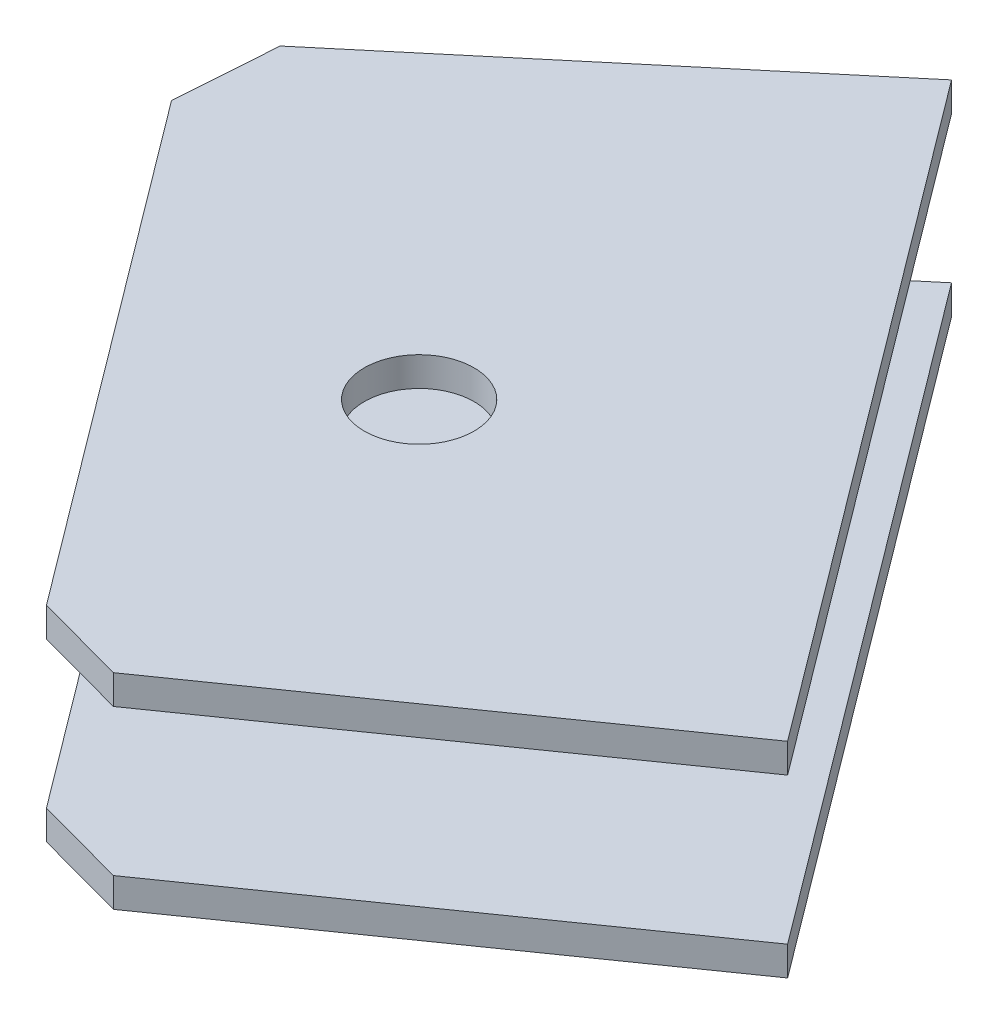
ISO-10303-21;
HEADER;
FILE_DESCRIPTION(('STEP AP214'),'2;1');
FILE_NAME('part.step','',(''),(''),'','','');
FILE_SCHEMA(('AUTOMOTIVE_DESIGN { 1 0 10303 214 1 1 1 1 }'));
ENDSEC;
DATA;
#1=APPLICATION_CONTEXT('core data for automotive mechanical design processes');
#2=APPLICATION_PROTOCOL_DEFINITION('international standard','automotive_design',2000,#1);
#3=PRODUCT_CONTEXT('',#1,'mechanical');
#4=PRODUCT('Part','Part','',(#3));
#5=PRODUCT_RELATED_PRODUCT_CATEGORY('part','',(#4));
#6=PRODUCT_DEFINITION_FORMATION('','',#4);
#7=PRODUCT_DEFINITION_CONTEXT('part definition',#1,'design');
#8=PRODUCT_DEFINITION('design','',#6,#7);
#9=PRODUCT_DEFINITION_SHAPE('','',#8);
#10=(LENGTH_UNIT() NAMED_UNIT(*) SI_UNIT(.MILLI.,.METRE.));
#11=(NAMED_UNIT(*) PLANE_ANGLE_UNIT() SI_UNIT($,.RADIAN.));
#12=(NAMED_UNIT(*) SI_UNIT($,.STERADIAN.) SOLID_ANGLE_UNIT());
#13=UNCERTAINTY_MEASURE_WITH_UNIT(LENGTH_MEASURE(1.E-05),#10,'distance_accuracy_value','');
#14=(GEOMETRIC_REPRESENTATION_CONTEXT(3) GLOBAL_UNCERTAINTY_ASSIGNED_CONTEXT((#13)) GLOBAL_UNIT_ASSIGNED_CONTEXT((#10,
#11,#12)) REPRESENTATION_CONTEXT('',''));
#15=CARTESIAN_POINT('',(0.,0.,0.));
#16=DIRECTION('',(0.,0.,1.));
#17=DIRECTION('',(1.,0.,0.));
#18=AXIS2_PLACEMENT_3D('',#15,#16,#17);
#19=CARTESIAN_POINT('',(41.6555289758713,-8.89,9.6980282279427));
#20=DIRECTION('',(0.800145765414735,0.,-0.59980559691359));
#21=DIRECTION('',(-0.59980559691359,0.,-0.800145765414735));
#22=AXIS2_PLACEMENT_3D('',#19,#20,#21);
#23=PLANE('',#22);
#24=DIRECTION('',(-0.59980559691359,0.,-0.800145765414735));
#25=VECTOR('',#24,1.);
#26=CARTESIAN_POINT('',(41.6555289758713,-6.35,9.6980282279427));
#27=LINE('',#26,#25);
#28=CARTESIAN_POINT('',(41.6555289758713,-6.35,9.6980282279427));
#29=VERTEX_POINT('',#28);
#30=CARTESIAN_POINT('',(-0.915104632580494,-6.35,-47.0915589117921));
#31=VERTEX_POINT('',#30);
#32=EDGE_CURVE('E129',#29,#31,#27,.T.);
#33=ORIENTED_EDGE('',*,*,#32,.F.);
#34=DIRECTION('',(0.,1.,0.));
#35=VECTOR('',#34,1.);
#36=CARTESIAN_POINT('',(41.6555289758713,-8.89,9.6980282279427));
#37=LINE('',#36,#35);
#38=CARTESIAN_POINT('',(41.6555289758713,-8.89,9.6980282279427));
#39=VERTEX_POINT('',#38);
#40=EDGE_CURVE('E12',#39,#29,#37,.T.);
#41=ORIENTED_EDGE('',*,*,#40,.F.);
#42=DIRECTION('',(-0.59980559691359,0.,-0.800145765414735));
#43=VECTOR('',#42,1.);
#44=CARTESIAN_POINT('',(41.6555289758713,-8.89,9.6980282279427));
#45=LINE('',#44,#43);
#46=CARTESIAN_POINT('',(-0.915104632580494,-8.89,-47.0915589117921));
#47=VERTEX_POINT('',#46);
#48=EDGE_CURVE('E144',#39,#47,#45,.T.);
#49=ORIENTED_EDGE('',*,*,#48,.T.);
#50=DIRECTION('',(0.,1.,0.));
#51=VECTOR('',#50,1.);
#52=CARTESIAN_POINT('',(-0.915104632580494,-8.89,-47.0915589117921));
#53=LINE('',#52,#51);
#54=EDGE_CURVE('E47',#47,#31,#53,.T.);
#55=ORIENTED_EDGE('',*,*,#54,.T.);
#56=EDGE_LOOP('',(#33,#41,#49,#55));
#57=FACE_BOUND('',#56,.T.);
#58=ADVANCED_FACE('F44',(#57),#23,.T.);
#59=CARTESIAN_POINT('',(7.25877099269151,-8.89,33.7828998711313));
#60=DIRECTION('',(0.573576474916968,0.,0.819152017284841));
#61=DIRECTION('',(0.819152017284841,0.,-0.573576474916968));
#62=AXIS2_PLACEMENT_3D('',#59,#60,#61);
#63=PLANE('',#62);
#64=DIRECTION('',(0.819152017284841,0.,-0.573576474916968));
#65=VECTOR('',#64,1.);
#66=CARTESIAN_POINT('',(7.25877099269151,-6.35,33.7828998711313));
#67=LINE('',#66,#65);
#68=CARTESIAN_POINT('',(7.25877099269151,-6.35,33.7828998711313));
#69=VERTEX_POINT('',#68);
#70=EDGE_CURVE('E142',#69,#29,#67,.T.);
#71=ORIENTED_EDGE('',*,*,#70,.F.);
#72=DIRECTION('',(0.,1.,0.));
#73=VECTOR('',#72,1.);
#74=CARTESIAN_POINT('',(7.25877099269151,-8.89,33.7828998711313));
#75=LINE('',#74,#73);
#76=CARTESIAN_POINT('',(7.25877099269151,-8.89,33.7828998711313));
#77=VERTEX_POINT('',#76);
#78=EDGE_CURVE('E53',#77,#69,#75,.T.);
#79=ORIENTED_EDGE('',*,*,#78,.F.);
#80=DIRECTION('',(0.819152017284841,0.,-0.573576474916968));
#81=VECTOR('',#80,1.);
#82=CARTESIAN_POINT('',(7.25877099269151,-8.89,33.7828998711313));
#83=LINE('',#82,#81);
#84=EDGE_CURVE('E119',#77,#39,#83,.T.);
#85=ORIENTED_EDGE('',*,*,#84,.T.);
#86=ORIENTED_EDGE('',*,*,#40,.T.);
#87=EDGE_LOOP('',(#71,#79,#85,#86));
#88=FACE_BOUND('',#87,.T.);
#89=ADVANCED_FACE('F152',(#88),#63,.T.);
#90=CARTESIAN_POINT('',(-0.713995357917185,-8.89,31.6135726354231));
#91=DIRECTION('',(-0.262546956242129,0.,0.964919217223905));
#92=DIRECTION('',(0.964919217223905,0.,0.262546956242129));
#93=AXIS2_PLACEMENT_3D('',#90,#91,#92);
#94=PLANE('',#93);
#95=DIRECTION('',(0.964919217223905,0.,0.262546956242129));
#96=VECTOR('',#95,1.);
#97=CARTESIAN_POINT('',(-0.713995357917185,-6.35,31.6135726354231));
#98=LINE('',#97,#96);
#99=CARTESIAN_POINT('',(-0.713995357917185,-6.35,31.6135726354231));
#100=VERTEX_POINT('',#99);
#101=EDGE_CURVE('E106',#100,#69,#98,.T.);
#102=ORIENTED_EDGE('',*,*,#101,.F.);
#103=DIRECTION('',(0.,1.,0.));
#104=VECTOR('',#103,1.);
#105=CARTESIAN_POINT('',(-0.713995357917185,-8.89,31.6135726354231));
#106=LINE('',#105,#104);
#107=CARTESIAN_POINT('',(-0.713995357917185,-8.89,31.6135726354231));
#108=VERTEX_POINT('',#107);
#109=EDGE_CURVE('E101',#108,#100,#106,.T.);
#110=ORIENTED_EDGE('',*,*,#109,.F.);
#111=DIRECTION('',(0.964919217223905,0.,0.262546956242129));
#112=VECTOR('',#111,1.);
#113=CARTESIAN_POINT('',(-0.713995357917185,-8.89,31.6135726354231));
#114=LINE('',#113,#112);
#115=EDGE_CURVE('E104',#108,#77,#114,.T.);
#116=ORIENTED_EDGE('',*,*,#115,.T.);
#117=ORIENTED_EDGE('',*,*,#78,.T.);
#118=EDGE_LOOP('',(#102,#110,#116,#117));
#119=FACE_BOUND('',#118,.T.);
#120=ADVANCED_FACE('F103',(#119),#94,.T.);
#121=CARTESIAN_POINT('',(-33.1949115193188,-8.89,-11.7162456541505));
#122=DIRECTION('',(-0.80014576541472,0.,0.59980559691361));
#123=DIRECTION('',(0.59980559691361,0.,0.80014576541472));
#124=AXIS2_PLACEMENT_3D('',#121,#122,#123);
#125=PLANE('',#124);
#126=DIRECTION('',(0.59980559691361,0.,0.80014576541472));
#127=VECTOR('',#126,1.);
#128=CARTESIAN_POINT('',(-33.1949115193188,-6.35,-11.7162456541505));
#129=LINE('',#128,#127);
#130=CARTESIAN_POINT('',(-33.1949115193188,-6.35,-11.7162456541505));
#131=VERTEX_POINT('',#130);
#132=EDGE_CURVE('E139',#131,#100,#129,.T.);
#133=ORIENTED_EDGE('',*,*,#132,.F.);
#134=DIRECTION('',(0.,1.,0.));
#135=VECTOR('',#134,1.);
#136=CARTESIAN_POINT('',(-33.1949115193188,-8.89,-11.7162456541505));
#137=LINE('',#136,#135);
#138=CARTESIAN_POINT('',(-33.1949115193188,-8.89,-11.7162456541505));
#139=VERTEX_POINT('',#138);
#140=EDGE_CURVE('E111',#139,#131,#137,.T.);
#141=ORIENTED_EDGE('',*,*,#140,.F.);
#142=DIRECTION('',(0.59980559691361,0.,0.80014576541472));
#143=VECTOR('',#142,1.);
#144=CARTESIAN_POINT('',(-33.1949115193188,-8.89,-11.7162456541505));
#145=LINE('',#144,#143);
#146=EDGE_CURVE('E117',#139,#108,#145,.T.);
#147=ORIENTED_EDGE('',*,*,#146,.T.);
#148=ORIENTED_EDGE('',*,*,#109,.T.);
#149=EDGE_LOOP('',(#133,#141,#147,#148));
#150=FACE_BOUND('',#149,.T.);
#151=ADVANCED_FACE('F121',(#150),#125,.T.);
#152=CARTESIAN_POINT('',(-32.5772901880226,-8.89,-20.52382814973));
#153=DIRECTION('',(-0.997550355547096,0.,-0.0699520417705032));
#154=DIRECTION('',(-0.0699520417705032,0.,0.997550355547096));
#155=AXIS2_PLACEMENT_3D('',#152,#153,#154);
#156=PLANE('',#155);
#157=DIRECTION('',(-0.0699520417705032,0.,0.997550355547096));
#158=VECTOR('',#157,1.);
#159=CARTESIAN_POINT('',(-32.5772901880226,-6.35,-20.52382814973));
#160=LINE('',#159,#158);
#161=CARTESIAN_POINT('',(-32.5772901880226,-6.35,-20.52382814973));
#162=VERTEX_POINT('',#161);
#163=EDGE_CURVE('E136',#162,#131,#160,.T.);
#164=ORIENTED_EDGE('',*,*,#163,.F.);
#165=DIRECTION('',(0.,1.,0.));
#166=VECTOR('',#165,1.);
#167=CARTESIAN_POINT('',(-32.5772901880226,-8.89,-20.52382814973));
#168=LINE('',#167,#166);
#169=CARTESIAN_POINT('',(-32.5772901880226,-8.89,-20.52382814973));
#170=VERTEX_POINT('',#169);
#171=EDGE_CURVE('E147',#170,#162,#168,.T.);
#172=ORIENTED_EDGE('',*,*,#171,.F.);
#173=DIRECTION('',(-0.0699520417705032,0.,0.997550355547096));
#174=VECTOR('',#173,1.);
#175=CARTESIAN_POINT('',(-32.5772901880226,-8.89,-20.52382814973));
#176=LINE('',#175,#174);
#177=EDGE_CURVE('E122',#170,#139,#176,.T.);
#178=ORIENTED_EDGE('',*,*,#177,.T.);
#179=ORIENTED_EDGE('',*,*,#140,.T.);
#180=EDGE_LOOP('',(#164,#172,#178,#179));
#181=FACE_BOUND('',#180,.T.);
#182=ADVANCED_FACE('F165',(#181),#156,.T.);
#183=CARTESIAN_POINT('',(-0.915104632580494,-8.89,-47.0915589117921));
#184=DIRECTION('',(-0.642787645752125,0.,-0.766044412856357));
#185=DIRECTION('',(-0.766044412856357,0.,0.642787645752125));
#186=AXIS2_PLACEMENT_3D('',#183,#184,#185);
#187=PLANE('',#186);
#188=DIRECTION('',(-0.766044412856357,0.,0.642787645752125));
#189=VECTOR('',#188,1.);
#190=CARTESIAN_POINT('',(-0.915104632580494,-6.35,-47.0915589117921));
#191=LINE('',#190,#189);
#192=EDGE_CURVE('E132',#31,#162,#191,.T.);
#193=ORIENTED_EDGE('',*,*,#192,.F.);
#194=ORIENTED_EDGE('',*,*,#54,.F.);
#195=DIRECTION('',(-0.766044412856357,0.,0.642787645752125));
#196=VECTOR('',#195,1.);
#197=CARTESIAN_POINT('',(-0.915104632580494,-8.89,-47.0915589117921));
#198=LINE('',#197,#196);
#199=EDGE_CURVE('E124',#47,#170,#198,.T.);
#200=ORIENTED_EDGE('',*,*,#199,.T.);
#201=ORIENTED_EDGE('',*,*,#171,.T.);
#202=EDGE_LOOP('',(#193,#194,#200,#201));
#203=FACE_BOUND('',#202,.T.);
#204=ADVANCED_FACE('F149',(#203),#187,.T.);
#205=CARTESIAN_POINT('',(41.6555289758713,-8.89,9.6980282279427));
#206=DIRECTION('',(0.,-1.,0.));
#207=DIRECTION('',(0.,0.,-1.));
#208=AXIS2_PLACEMENT_3D('',#205,#206,#207);
#209=PLANE('',#208);
#210=CARTESIAN_POINT('',(0.,-8.89,0.));
#211=DIRECTION('',(0.,1.,0.));
#212=DIRECTION('',(0.,0.,1.));
#213=AXIS2_PLACEMENT_3D('',#210,#211,#212);
#214=CIRCLE('',#213,4.7625);
#215=CARTESIAN_POINT('',(0.,-8.89,4.7625));
#216=VERTEX_POINT('',#215);
#217=EDGE_CURVE('E133',#216,#216,#214,.T.);
#218=ORIENTED_EDGE('',*,*,#217,.T.);
#219=EDGE_LOOP('',(#218));
#220=FACE_BOUND('',#219,.T.);
#221=ORIENTED_EDGE('',*,*,#48,.F.);
#222=ORIENTED_EDGE('',*,*,#84,.F.);
#223=ORIENTED_EDGE('',*,*,#115,.F.);
#224=ORIENTED_EDGE('',*,*,#146,.F.);
#225=ORIENTED_EDGE('',*,*,#177,.F.);
#226=ORIENTED_EDGE('',*,*,#199,.F.);
#227=EDGE_LOOP('',(#221,#222,#223,#224,#225,#226));
#228=FACE_BOUND('',#227,.T.);
#229=ADVANCED_FACE('F115',(#220,#228),#209,.T.);
#230=CARTESIAN_POINT('',(41.6555289758713,-6.35,9.6980282279427));
#231=DIRECTION('',(0.,-1.,0.));
#232=DIRECTION('',(0.,0.,-1.));
#233=AXIS2_PLACEMENT_3D('',#230,#231,#232);
#234=PLANE('',#233);
#235=CARTESIAN_POINT('',(0.,-6.35,0.));
#236=DIRECTION('',(0.,1.,0.));
#237=DIRECTION('',(0.,0.,1.));
#238=AXIS2_PLACEMENT_3D('',#235,#236,#237);
#239=CIRCLE('',#238,4.7625);
#240=CARTESIAN_POINT('',(0.,-6.35,4.7625));
#241=VERTEX_POINT('',#240);
#242=EDGE_CURVE('E188',#241,#241,#239,.T.);
#243=ORIENTED_EDGE('',*,*,#242,.F.);
#244=EDGE_LOOP('',(#243));
#245=FACE_BOUND('',#244,.T.);
#246=ORIENTED_EDGE('',*,*,#32,.T.);
#247=ORIENTED_EDGE('',*,*,#192,.T.);
#248=ORIENTED_EDGE('',*,*,#163,.T.);
#249=ORIENTED_EDGE('',*,*,#132,.T.);
#250=ORIENTED_EDGE('',*,*,#101,.T.);
#251=ORIENTED_EDGE('',*,*,#70,.T.);
#252=EDGE_LOOP('',(#246,#247,#248,#249,#250,#251));
#253=FACE_BOUND('',#252,.T.);
#254=ADVANCED_FACE('F151',(#245,#253),#234,.F.);
#255=CARTESIAN_POINT('',(0.,-8.89,0.));
#256=DIRECTION('',(0.,1.,0.));
#257=DIRECTION('',(0.,0.,1.));
#258=AXIS2_PLACEMENT_3D('',#255,#256,#257);
#259=CYLINDRICAL_SURFACE('',#258,4.7625);
#260=ORIENTED_EDGE('',*,*,#217,.F.);
#261=EDGE_LOOP('',(#260));
#262=FACE_BOUND('',#261,.T.);
#263=ORIENTED_EDGE('',*,*,#242,.T.);
#264=EDGE_LOOP('',(#263));
#265=FACE_BOUND('',#264,.T.);
#266=ADVANCED_FACE('F176',(#262,#265),#259,.F.);
#267=CLOSED_SHELL('',(#58,#89,#120,#151,#182,#204,#229,#254,#266));
#268=MANIFOLD_SOLID_BREP('B2',#267);
#269=CARTESIAN_POINT('',(-35.5683381020818,8.89,22.1299791532374));
#270=DIRECTION('',(0.,-1.,0.));
#271=DIRECTION('',(0.,0.,-1.));
#272=AXIS2_PLACEMENT_3D('',#269,#270,#271);
#273=PLANE('',#272);
#274=DIRECTION('',(-0.0699520417705032,0.,0.997550355547096));
#275=VECTOR('',#274,1.);
#276=CARTESIAN_POINT('',(-33.1949115193188,8.89,-11.7162456541505));
#277=LINE('',#276,#275);
#278=CARTESIAN_POINT('',(-32.5772901880226,8.89,-20.52382814973));
#279=VERTEX_POINT('',#278);
#280=CARTESIAN_POINT('',(-33.1949115193188,8.89,-11.7162456541505));
#281=VERTEX_POINT('',#280);
#282=EDGE_CURVE('E336',#279,#281,#277,.T.);
#283=ORIENTED_EDGE('',*,*,#282,.T.);
#284=DIRECTION('',(0.59980559691361,0.,0.80014576541472));
#285=VECTOR('',#284,1.);
#286=CARTESIAN_POINT('',(-0.713995357917185,8.89,31.6135726354231));
#287=LINE('',#286,#285);
#288=CARTESIAN_POINT('',(-0.713995357917185,8.89,31.6135726354231));
#289=VERTEX_POINT('',#288);
#290=EDGE_CURVE('E294',#281,#289,#287,.T.);
#291=ORIENTED_EDGE('',*,*,#290,.T.);
#292=DIRECTION('',(0.964919217223905,0.,0.262546956242129));
#293=VECTOR('',#292,1.);
#294=CARTESIAN_POINT('',(-0.713995357917185,8.89,31.6135726354231));
#295=LINE('',#294,#293);
#296=CARTESIAN_POINT('',(7.25877099269151,8.89,33.7828998711313));
#297=VERTEX_POINT('',#296);
#298=EDGE_CURVE('E307',#289,#297,#295,.T.);
#299=ORIENTED_EDGE('',*,*,#298,.T.);
#300=DIRECTION('',(0.819152017284841,0.,-0.573576474916968));
#301=VECTOR('',#300,1.);
#302=CARTESIAN_POINT('',(7.25877099269151,8.89,33.7828998711313));
#303=LINE('',#302,#301);
#304=CARTESIAN_POINT('',(41.6555289758713,8.89,9.6980282279427));
#305=VERTEX_POINT('',#304);
#306=EDGE_CURVE('E301',#297,#305,#303,.T.);
#307=ORIENTED_EDGE('',*,*,#306,.T.);
#308=DIRECTION('',(-0.59980559691359,0.,-0.800145765414735));
#309=VECTOR('',#308,1.);
#310=CARTESIAN_POINT('',(41.6555289758713,8.89,9.6980282279427));
#311=LINE('',#310,#309);
#312=CARTESIAN_POINT('',(-0.915104632580494,8.89,-47.0915589117921));
#313=VERTEX_POINT('',#312);
#314=EDGE_CURVE('E305',#305,#313,#311,.T.);
#315=ORIENTED_EDGE('',*,*,#314,.T.);
#316=DIRECTION('',(-0.766044412856357,0.,0.642787645752125));
#317=VECTOR('',#316,1.);
#318=CARTESIAN_POINT('',(-0.915104632580494,8.89,-47.0915589117921));
#319=LINE('',#318,#317);
#320=EDGE_CURVE('E257',#313,#279,#319,.T.);
#321=ORIENTED_EDGE('',*,*,#320,.T.);
#322=EDGE_LOOP('',(#283,#291,#299,#307,#315,#321));
#323=FACE_BOUND('',#322,.T.);
#324=CARTESIAN_POINT('',(0.,8.89,0.));
#325=DIRECTION('',(0.,1.,0.));
#326=DIRECTION('',(0.,0.,1.));
#327=AXIS2_PLACEMENT_3D('',#324,#325,#326);
#328=CIRCLE('',#327,4.7625);
#329=CARTESIAN_POINT('',(0.,8.89,4.7625));
#330=VERTEX_POINT('',#329);
#331=EDGE_CURVE('E329',#330,#330,#328,.T.);
#332=ORIENTED_EDGE('',*,*,#331,.F.);
#333=EDGE_LOOP('',(#332));
#334=FACE_BOUND('',#333,.T.);
#335=ADVANCED_FACE('F240',(#323,#334),#273,.F.);
#336=CARTESIAN_POINT('',(-35.5683381020818,6.35,22.1299791532374));
#337=DIRECTION('',(0.,-1.,0.));
#338=DIRECTION('',(0.,0.,-1.));
#339=AXIS2_PLACEMENT_3D('',#336,#337,#338);
#340=PLANE('',#339);
#341=DIRECTION('',(-0.0699520417705032,0.,0.997550355547096));
#342=VECTOR('',#341,1.);
#343=CARTESIAN_POINT('',(-33.1949115193188,6.35,-11.7162456541505));
#344=LINE('',#343,#342);
#345=CARTESIAN_POINT('',(-32.5772901880226,6.35,-20.52382814973));
#346=VERTEX_POINT('',#345);
#347=CARTESIAN_POINT('',(-33.1949115193188,6.35,-11.7162456541505));
#348=VERTEX_POINT('',#347);
#349=EDGE_CURVE('E325',#346,#348,#344,.T.);
#350=ORIENTED_EDGE('',*,*,#349,.F.);
#351=DIRECTION('',(-0.766044412856357,0.,0.642787645752125));
#352=VECTOR('',#351,1.);
#353=CARTESIAN_POINT('',(-0.915104632580494,6.35,-47.0915589117921));
#354=LINE('',#353,#352);
#355=CARTESIAN_POINT('',(-0.915104632580494,6.35,-47.0915589117921));
#356=VERTEX_POINT('',#355);
#357=EDGE_CURVE('E286',#356,#346,#354,.T.);
#358=ORIENTED_EDGE('',*,*,#357,.F.);
#359=DIRECTION('',(-0.59980559691359,0.,-0.800145765414735));
#360=VECTOR('',#359,1.);
#361=CARTESIAN_POINT('',(41.6555289758713,6.35,9.6980282279427));
#362=LINE('',#361,#360);
#363=CARTESIAN_POINT('',(41.6555289758713,6.35,9.6980282279427));
#364=VERTEX_POINT('',#363);
#365=EDGE_CURVE('E280',#364,#356,#362,.T.);
#366=ORIENTED_EDGE('',*,*,#365,.F.);
#367=DIRECTION('',(0.819152017284841,0.,-0.573576474916968));
#368=VECTOR('',#367,1.);
#369=CARTESIAN_POINT('',(7.25877099269151,6.35,33.7828998711313));
#370=LINE('',#369,#368);
#371=CARTESIAN_POINT('',(7.25877099269151,6.35,33.7828998711313));
#372=VERTEX_POINT('',#371);
#373=EDGE_CURVE('E315',#372,#364,#370,.T.);
#374=ORIENTED_EDGE('',*,*,#373,.F.);
#375=DIRECTION('',(0.964919217223905,0.,0.262546956242129));
#376=VECTOR('',#375,1.);
#377=CARTESIAN_POINT('',(-0.713995357917185,6.35,31.6135726354231));
#378=LINE('',#377,#376);
#379=CARTESIAN_POINT('',(-0.713995357917185,6.35,31.6135726354231));
#380=VERTEX_POINT('',#379);
#381=EDGE_CURVE('E331',#380,#372,#378,.T.);
#382=ORIENTED_EDGE('',*,*,#381,.F.);
#383=DIRECTION('',(0.59980559691361,0.,0.80014576541472));
#384=VECTOR('',#383,1.);
#385=CARTESIAN_POINT('',(-0.713995357917185,6.35,31.6135726354231));
#386=LINE('',#385,#384);
#387=EDGE_CURVE('E328',#348,#380,#386,.T.);
#388=ORIENTED_EDGE('',*,*,#387,.F.);
#389=EDGE_LOOP('',(#350,#358,#366,#374,#382,#388));
#390=FACE_BOUND('',#389,.T.);
#391=CARTESIAN_POINT('',(0.,6.35,0.));
#392=DIRECTION('',(0.,1.,0.));
#393=DIRECTION('',(0.,0.,1.));
#394=AXIS2_PLACEMENT_3D('',#391,#392,#393);
#395=CIRCLE('',#394,4.7625);
#396=CARTESIAN_POINT('',(0.,6.35,4.7625));
#397=VERTEX_POINT('',#396);
#398=EDGE_CURVE('E429',#397,#397,#395,.T.);
#399=ORIENTED_EDGE('',*,*,#398,.T.);
#400=EDGE_LOOP('',(#399));
#401=FACE_BOUND('',#400,.T.);
#402=ADVANCED_FACE('F345',(#390,#401),#340,.T.);
#403=CARTESIAN_POINT('',(-33.1949115193188,8.89,-11.7162456541505));
#404=DIRECTION('',(0.997550355547096,0.,0.0699520417705032));
#405=DIRECTION('',(0.0699520417705032,0.,-0.997550355547096));
#406=AXIS2_PLACEMENT_3D('',#403,#404,#405);
#407=PLANE('',#406);
#408=ORIENTED_EDGE('',*,*,#349,.T.);
#409=DIRECTION('',(0.,-1.,0.));
#410=VECTOR('',#409,1.);
#411=CARTESIAN_POINT('',(-33.1949115193188,8.89,-11.7162456541505));
#412=LINE('',#411,#410);
#413=EDGE_CURVE('E42',#281,#348,#412,.T.);
#414=ORIENTED_EDGE('',*,*,#413,.F.);
#415=ORIENTED_EDGE('',*,*,#282,.F.);
#416=DIRECTION('',(0.,-1.,0.));
#417=VECTOR('',#416,1.);
#418=CARTESIAN_POINT('',(-32.5772901880226,8.89,-20.52382814973));
#419=LINE('',#418,#417);
#420=EDGE_CURVE('E321',#279,#346,#419,.T.);
#421=ORIENTED_EDGE('',*,*,#420,.T.);
#422=EDGE_LOOP('',(#408,#414,#415,#421));
#423=FACE_BOUND('',#422,.T.);
#424=ADVANCED_FACE('F242',(#423),#407,.F.);
#425=CARTESIAN_POINT('',(-0.713995357917185,8.89,31.6135726354231));
#426=DIRECTION('',(0.80014576541472,0.,-0.59980559691361));
#427=DIRECTION('',(-0.59980559691361,0.,-0.80014576541472));
#428=AXIS2_PLACEMENT_3D('',#425,#426,#427);
#429=PLANE('',#428);
#430=ORIENTED_EDGE('',*,*,#387,.T.);
#431=DIRECTION('',(0.,-1.,0.));
#432=VECTOR('',#431,1.);
#433=CARTESIAN_POINT('',(-0.713995357917185,8.89,31.6135726354231));
#434=LINE('',#433,#432);
#435=EDGE_CURVE('E249',#289,#380,#434,.T.);
#436=ORIENTED_EDGE('',*,*,#435,.F.);
#437=ORIENTED_EDGE('',*,*,#290,.F.);
#438=ORIENTED_EDGE('',*,*,#413,.T.);
#439=EDGE_LOOP('',(#430,#436,#437,#438));
#440=FACE_BOUND('',#439,.T.);
#441=ADVANCED_FACE('F370',(#440),#429,.F.);
#442=CARTESIAN_POINT('',(-0.713995357917185,8.89,31.6135726354231));
#443=DIRECTION('',(0.262546956242129,0.,-0.964919217223905));
#444=DIRECTION('',(-0.964919217223905,0.,-0.262546956242129));
#445=AXIS2_PLACEMENT_3D('',#442,#443,#444);
#446=PLANE('',#445);
#447=ORIENTED_EDGE('',*,*,#381,.T.);
#448=DIRECTION('',(0.,-1.,0.));
#449=VECTOR('',#448,1.);
#450=CARTESIAN_POINT('',(7.25877099269151,8.89,33.7828998711313));
#451=LINE('',#450,#449);
#452=EDGE_CURVE('E316',#297,#372,#451,.T.);
#453=ORIENTED_EDGE('',*,*,#452,.F.);
#454=ORIENTED_EDGE('',*,*,#298,.F.);
#455=ORIENTED_EDGE('',*,*,#435,.T.);
#456=EDGE_LOOP('',(#447,#453,#454,#455));
#457=FACE_BOUND('',#456,.T.);
#458=ADVANCED_FACE('F342',(#457),#446,.F.);
#459=CARTESIAN_POINT('',(7.25877099269151,8.89,33.7828998711313));
#460=DIRECTION('',(-0.573576474916968,0.,-0.819152017284841));
#461=DIRECTION('',(-0.819152017284841,0.,0.573576474916968));
#462=AXIS2_PLACEMENT_3D('',#459,#460,#461);
#463=PLANE('',#462);
#464=ORIENTED_EDGE('',*,*,#373,.T.);
#465=DIRECTION('',(0.,-1.,0.));
#466=VECTOR('',#465,1.);
#467=CARTESIAN_POINT('',(41.6555289758713,8.89,9.6980282279427));
#468=LINE('',#467,#466);
#469=EDGE_CURVE('E312',#305,#364,#468,.T.);
#470=ORIENTED_EDGE('',*,*,#469,.F.);
#471=ORIENTED_EDGE('',*,*,#306,.F.);
#472=ORIENTED_EDGE('',*,*,#452,.T.);
#473=EDGE_LOOP('',(#464,#470,#471,#472));
#474=FACE_BOUND('',#473,.T.);
#475=ADVANCED_FACE('F313',(#474),#463,.F.);
#476=CARTESIAN_POINT('',(41.6555289758713,8.89,9.6980282279427));
#477=DIRECTION('',(-0.800145765414735,0.,0.59980559691359));
#478=DIRECTION('',(0.59980559691359,0.,0.800145765414735));
#479=AXIS2_PLACEMENT_3D('',#476,#477,#478);
#480=PLANE('',#479);
#481=ORIENTED_EDGE('',*,*,#365,.T.);
#482=DIRECTION('',(0.,-1.,0.));
#483=VECTOR('',#482,1.);
#484=CARTESIAN_POINT('',(-0.915104632580494,8.89,-47.0915589117921));
#485=LINE('',#484,#483);
#486=EDGE_CURVE('E317',#313,#356,#485,.T.);
#487=ORIENTED_EDGE('',*,*,#486,.F.);
#488=ORIENTED_EDGE('',*,*,#314,.F.);
#489=ORIENTED_EDGE('',*,*,#469,.T.);
#490=EDGE_LOOP('',(#481,#487,#488,#489));
#491=FACE_BOUND('',#490,.T.);
#492=ADVANCED_FACE('F319',(#491),#480,.F.);
#493=CARTESIAN_POINT('',(-0.915104632580494,8.89,-47.0915589117921));
#494=DIRECTION('',(0.642787645752125,0.,0.766044412856357));
#495=DIRECTION('',(0.766044412856357,0.,-0.642787645752125));
#496=AXIS2_PLACEMENT_3D('',#493,#494,#495);
#497=PLANE('',#496);
#498=ORIENTED_EDGE('',*,*,#357,.T.);
#499=ORIENTED_EDGE('',*,*,#420,.F.);
#500=ORIENTED_EDGE('',*,*,#320,.F.);
#501=ORIENTED_EDGE('',*,*,#486,.T.);
#502=EDGE_LOOP('',(#498,#499,#500,#501));
#503=FACE_BOUND('',#502,.T.);
#504=ADVANCED_FACE('F350',(#503),#497,.F.);
#505=CARTESIAN_POINT('',(0.,8.89,0.));
#506=DIRECTION('',(0.,-1.,0.));
#507=DIRECTION('',(0.,0.,-1.));
#508=AXIS2_PLACEMENT_3D('',#505,#506,#507);
#509=CYLINDRICAL_SURFACE('',#508,4.7625);
#510=ORIENTED_EDGE('',*,*,#331,.T.);
#511=EDGE_LOOP('',(#510));
#512=FACE_BOUND('',#511,.T.);
#513=ORIENTED_EDGE('',*,*,#398,.F.);
#514=EDGE_LOOP('',(#513));
#515=FACE_BOUND('',#514,.T.);
#516=ADVANCED_FACE('F352',(#512,#515),#509,.F.);
#517=CLOSED_SHELL('',(#335,#402,#424,#441,#458,#475,#492,#504,#516));
#518=MANIFOLD_SOLID_BREP('B6',#517);
#519=ADVANCED_BREP_SHAPE_REPRESENTATION('',(#18,#268,#518),#14);
#520=SHAPE_DEFINITION_REPRESENTATION(#9,#519);
ENDSEC;
END-ISO-10303-21;
